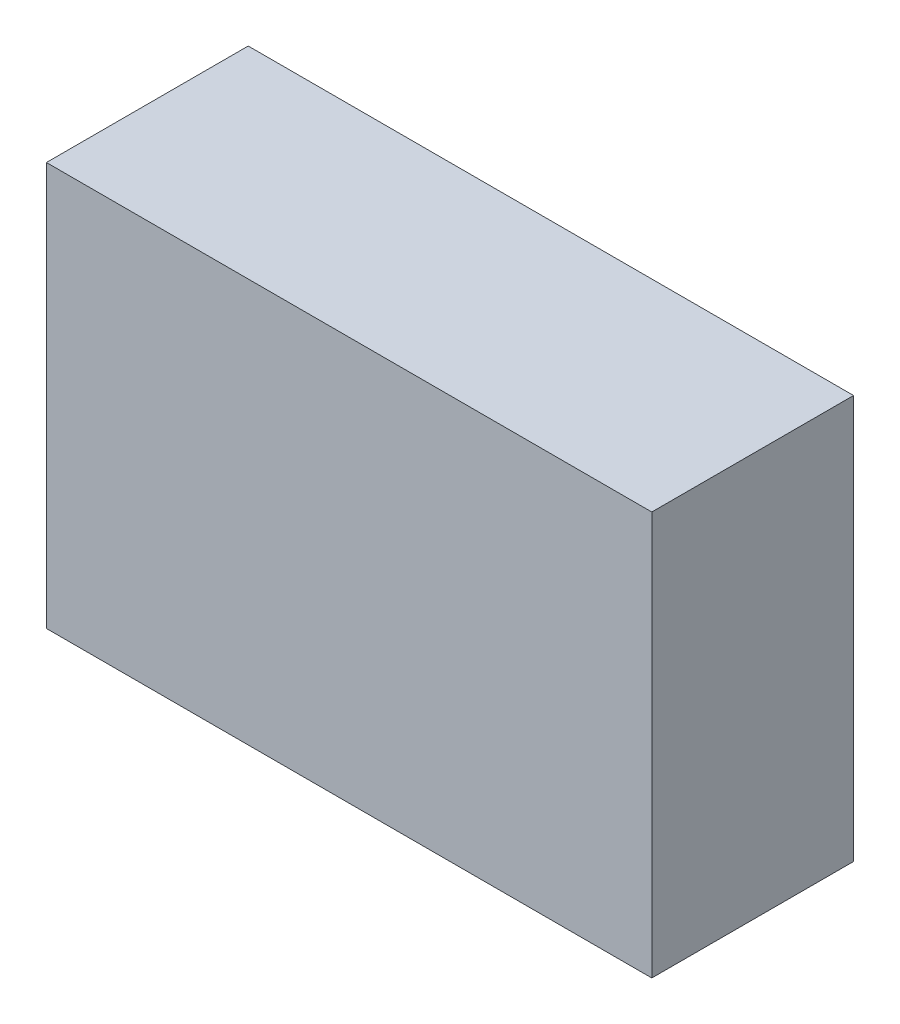
ISO-10303-21;
HEADER;
FILE_DESCRIPTION(('STEP AP214'),'2;1');
FILE_NAME('part.step','',(''),(''),'','','');
FILE_SCHEMA(('AUTOMOTIVE_DESIGN { 1 0 10303 214 1 1 1 1 }'));
ENDSEC;
DATA;
#1=APPLICATION_CONTEXT('core data for automotive mechanical design processes');
#2=APPLICATION_PROTOCOL_DEFINITION('international standard','automotive_design',2000,#1);
#3=PRODUCT_CONTEXT('',#1,'mechanical');
#4=PRODUCT('Part','Part','',(#3));
#5=PRODUCT_RELATED_PRODUCT_CATEGORY('part','',(#4));
#6=PRODUCT_DEFINITION_FORMATION('','',#4);
#7=PRODUCT_DEFINITION_CONTEXT('part definition',#1,'design');
#8=PRODUCT_DEFINITION('design','',#6,#7);
#9=PRODUCT_DEFINITION_SHAPE('','',#8);
#10=(LENGTH_UNIT() NAMED_UNIT(*) SI_UNIT(.MILLI.,.METRE.));
#11=(NAMED_UNIT(*) PLANE_ANGLE_UNIT() SI_UNIT($,.RADIAN.));
#12=(NAMED_UNIT(*) SI_UNIT($,.STERADIAN.) SOLID_ANGLE_UNIT());
#13=UNCERTAINTY_MEASURE_WITH_UNIT(LENGTH_MEASURE(1.E-05),#10,'distance_accuracy_value','');
#14=(GEOMETRIC_REPRESENTATION_CONTEXT(3) GLOBAL_UNCERTAINTY_ASSIGNED_CONTEXT((#13)) GLOBAL_UNIT_ASSIGNED_CONTEXT((#10,
#11,#12)) REPRESENTATION_CONTEXT('',''));
#15=CARTESIAN_POINT('',(0.,0.,0.));
#16=DIRECTION('',(0.,0.,1.));
#17=DIRECTION('',(1.,0.,0.));
#18=AXIS2_PLACEMENT_3D('',#15,#16,#17);
#19=CARTESIAN_POINT('',(9.55156950672646,37.5336322869955,20.));
#20=DIRECTION('',(-1.,0.,0.));
#21=DIRECTION('',(0.,-1.,0.));
#22=AXIS2_PLACEMENT_3D('',#19,#20,#21);
#23=PLANE('',#22);
#24=DIRECTION('',(0.,1.,0.));
#25=VECTOR('',#24,1.);
#26=CARTESIAN_POINT('',(9.55156950672646,37.5336322869955,0.));
#27=LINE('',#26,#25);
#28=CARTESIAN_POINT('',(9.55156950672647,-2.46636771300448,0.));
#29=VERTEX_POINT('',#28);
#30=CARTESIAN_POINT('',(9.55156950672646,37.5336322869955,0.));
#31=VERTEX_POINT('',#30);
#32=EDGE_CURVE('E141',#29,#31,#27,.T.);
#33=ORIENTED_EDGE('',*,*,#32,.T.);
#34=DIRECTION('',(0.,0.,-1.));
#35=VECTOR('',#34,1.);
#36=CARTESIAN_POINT('',(9.55156950672646,37.5336322869955,20.));
#37=LINE('',#36,#35);
#38=CARTESIAN_POINT('',(9.55156950672646,37.5336322869955,20.));
#39=VERTEX_POINT('',#38);
#40=EDGE_CURVE('E11',#39,#31,#37,.T.);
#41=ORIENTED_EDGE('',*,*,#40,.F.);
#42=DIRECTION('',(0.,1.,0.));
#43=VECTOR('',#42,1.);
#44=CARTESIAN_POINT('',(9.55156950672646,37.5336322869955,20.));
#45=LINE('',#44,#43);
#46=CARTESIAN_POINT('',(9.55156950672647,-2.46636771300448,20.));
#47=VERTEX_POINT('',#46);
#48=EDGE_CURVE('E145',#47,#39,#45,.T.);
#49=ORIENTED_EDGE('',*,*,#48,.F.);
#50=DIRECTION('',(0.,0.,-1.));
#51=VECTOR('',#50,1.);
#52=CARTESIAN_POINT('',(9.55156950672647,-2.46636771300448,20.));
#53=LINE('',#52,#51);
#54=EDGE_CURVE('E151',#47,#29,#53,.T.);
#55=ORIENTED_EDGE('',*,*,#54,.T.);
#56=EDGE_LOOP('',(#33,#41,#49,#55));
#57=FACE_BOUND('',#56,.T.);
#58=ADVANCED_FACE('F33',(#57),#23,.F.);
#59=CARTESIAN_POINT('',(-50.4484304932735,37.5336322869955,20.));
#60=DIRECTION('',(0.,-1.,0.));
#61=DIRECTION('',(0.,0.,-1.));
#62=AXIS2_PLACEMENT_3D('',#59,#60,#61);
#63=PLANE('',#62);
#64=DIRECTION('',(-1.,0.,0.));
#65=VECTOR('',#64,1.);
#66=CARTESIAN_POINT('',(-50.4484304932735,37.5336322869955,0.));
#67=LINE('',#66,#65);
#68=CARTESIAN_POINT('',(-50.4484304932735,37.5336322869955,0.));
#69=VERTEX_POINT('',#68);
#70=EDGE_CURVE('E154',#31,#69,#67,.T.);
#71=ORIENTED_EDGE('',*,*,#70,.T.);
#72=DIRECTION('',(0.,0.,-1.));
#73=VECTOR('',#72,1.);
#74=CARTESIAN_POINT('',(-50.4484304932735,37.5336322869955,20.));
#75=LINE('',#74,#73);
#76=CARTESIAN_POINT('',(-50.4484304932735,37.5336322869955,20.));
#77=VERTEX_POINT('',#76);
#78=EDGE_CURVE('E40',#77,#69,#75,.T.);
#79=ORIENTED_EDGE('',*,*,#78,.F.);
#80=DIRECTION('',(-1.,0.,0.));
#81=VECTOR('',#80,1.);
#82=CARTESIAN_POINT('',(-50.4484304932735,37.5336322869955,20.));
#83=LINE('',#82,#81);
#84=EDGE_CURVE('E84',#39,#77,#83,.T.);
#85=ORIENTED_EDGE('',*,*,#84,.F.);
#86=ORIENTED_EDGE('',*,*,#40,.T.);
#87=EDGE_LOOP('',(#71,#79,#85,#86));
#88=FACE_BOUND('',#87,.T.);
#89=ADVANCED_FACE('F182',(#88),#63,.F.);
#90=CARTESIAN_POINT('',(-50.4484304932735,37.5336322869955,20.));
#91=DIRECTION('',(1.,0.,0.));
#92=DIRECTION('',(0.,1.,0.));
#93=AXIS2_PLACEMENT_3D('',#90,#91,#92);
#94=PLANE('',#93);
#95=DIRECTION('',(0.,0.,-1.));
#96=VECTOR('',#95,1.);
#97=CARTESIAN_POINT('',(-50.4484304932735,19.7645338009479,0.0671765926394813));
#98=LINE('',#97,#96);
#99=CARTESIAN_POINT('',(-50.4484304932735,19.7645338009479,2.61677832287105));
#100=VERTEX_POINT('',#99);
#101=CARTESIAN_POINT('',(-50.4484304932735,19.7645338009479,0.0671765926394813));
#102=VERTEX_POINT('',#101);
#103=EDGE_CURVE('E135',#100,#102,#98,.T.);
#104=ORIENTED_EDGE('',*,*,#103,.F.);
#105=DIRECTION('',(0.,1.,0.));
#106=VECTOR('',#105,1.);
#107=CARTESIAN_POINT('',(-50.4484304932735,19.7645338009479,2.61677832287105));
#108=LINE('',#107,#106);
#109=CARTESIAN_POINT('',(-50.4484304932735,15.3027307730431,2.61677832287105));
#110=VERTEX_POINT('',#109);
#111=EDGE_CURVE('E47',#110,#100,#108,.T.);
#112=ORIENTED_EDGE('',*,*,#111,.F.);
#113=DIRECTION('',(0.,0.,1.));
#114=VECTOR('',#113,1.);
#115=CARTESIAN_POINT('',(-50.4484304932735,15.3027307730431,0.0671765926394813));
#116=LINE('',#115,#114);
#117=CARTESIAN_POINT('',(-50.4484304932735,15.3027307730431,0.0671765926394813));
#118=VERTEX_POINT('',#117);
#119=EDGE_CURVE('E126',#118,#110,#116,.T.);
#120=ORIENTED_EDGE('',*,*,#119,.F.);
#121=DIRECTION('',(0.,-1.,0.));
#122=VECTOR('',#121,1.);
#123=CARTESIAN_POINT('',(-50.4484304932735,19.7645338009479,0.0671765926394813));
#124=LINE('',#123,#122);
#125=EDGE_CURVE('E129',#102,#118,#124,.T.);
#126=ORIENTED_EDGE('',*,*,#125,.F.);
#127=EDGE_LOOP('',(#104,#112,#120,#126));
#128=FACE_BOUND('',#127,.T.);
#129=DIRECTION('',(0.,-1.,0.));
#130=VECTOR('',#129,1.);
#131=CARTESIAN_POINT('',(-50.4484304932735,37.5336322869955,0.));
#132=LINE('',#131,#130);
#133=CARTESIAN_POINT('',(-50.4484304932735,-2.46636771300448,0.));
#134=VERTEX_POINT('',#133);
#135=EDGE_CURVE('E156',#69,#134,#132,.T.);
#136=ORIENTED_EDGE('',*,*,#135,.T.);
#137=DIRECTION('',(0.,0.,-1.));
#138=VECTOR('',#137,1.);
#139=CARTESIAN_POINT('',(-50.4484304932735,-2.46636771300448,20.));
#140=LINE('',#139,#138);
#141=CARTESIAN_POINT('',(-50.4484304932735,-2.46636771300448,20.));
#142=VERTEX_POINT('',#141);
#143=EDGE_CURVE('E160',#142,#134,#140,.T.);
#144=ORIENTED_EDGE('',*,*,#143,.F.);
#145=DIRECTION('',(0.,-1.,0.));
#146=VECTOR('',#145,1.);
#147=CARTESIAN_POINT('',(-50.4484304932735,37.5336322869955,20.));
#148=LINE('',#147,#146);
#149=EDGE_CURVE('E148',#77,#142,#148,.T.);
#150=ORIENTED_EDGE('',*,*,#149,.F.);
#151=ORIENTED_EDGE('',*,*,#78,.T.);
#152=EDGE_LOOP('',(#136,#144,#150,#151));
#153=FACE_BOUND('',#152,.T.);
#154=ADVANCED_FACE('F165',(#128,#153),#94,.F.);
#155=CARTESIAN_POINT('',(-50.4484304932735,-2.46636771300448,20.));
#156=DIRECTION('',(0.,1.,0.));
#157=DIRECTION('',(0.,0.,1.));
#158=AXIS2_PLACEMENT_3D('',#155,#156,#157);
#159=PLANE('',#158);
#160=DIRECTION('',(1.,0.,0.));
#161=VECTOR('',#160,1.);
#162=CARTESIAN_POINT('',(-50.4484304932735,-2.46636771300448,0.));
#163=LINE('',#162,#161);
#164=EDGE_CURVE('E77',#134,#29,#163,.T.);
#165=ORIENTED_EDGE('',*,*,#164,.T.);
#166=ORIENTED_EDGE('',*,*,#54,.F.);
#167=DIRECTION('',(1.,0.,0.));
#168=VECTOR('',#167,1.);
#169=CARTESIAN_POINT('',(-50.4484304932735,-2.46636771300448,20.));
#170=LINE('',#169,#168);
#171=EDGE_CURVE('E56',#142,#47,#170,.T.);
#172=ORIENTED_EDGE('',*,*,#171,.F.);
#173=ORIENTED_EDGE('',*,*,#143,.T.);
#174=EDGE_LOOP('',(#165,#166,#172,#173));
#175=FACE_BOUND('',#174,.T.);
#176=ADVANCED_FACE('F173',(#175),#159,.F.);
#177=CARTESIAN_POINT('',(0.,0.,20.));
#178=DIRECTION('',(0.,0.,1.));
#179=DIRECTION('',(1.,0.,0.));
#180=AXIS2_PLACEMENT_3D('',#177,#178,#179);
#181=PLANE('',#180);
#182=ORIENTED_EDGE('',*,*,#48,.T.);
#183=ORIENTED_EDGE('',*,*,#84,.T.);
#184=ORIENTED_EDGE('',*,*,#149,.T.);
#185=ORIENTED_EDGE('',*,*,#171,.T.);
#186=EDGE_LOOP('',(#182,#183,#184,#185));
#187=FACE_BOUND('',#186,.T.);
#188=ADVANCED_FACE('F175',(#187),#181,.T.);
#189=CARTESIAN_POINT('',(0.,0.,0.));
#190=DIRECTION('',(0.,0.,1.));
#191=DIRECTION('',(1.,0.,0.));
#192=AXIS2_PLACEMENT_3D('',#189,#190,#191);
#193=PLANE('',#192);
#194=ORIENTED_EDGE('',*,*,#32,.F.);
#195=ORIENTED_EDGE('',*,*,#164,.F.);
#196=ORIENTED_EDGE('',*,*,#135,.F.);
#197=ORIENTED_EDGE('',*,*,#70,.F.);
#198=EDGE_LOOP('',(#194,#195,#196,#197));
#199=FACE_BOUND('',#198,.T.);
#200=ADVANCED_FACE('F169',(#199),#193,.F.);
#201=CARTESIAN_POINT('',(-30.4484304932735,19.7645338009479,2.61677832287105));
#202=DIRECTION('',(0.,0.,1.));
#203=DIRECTION('',(1.,0.,0.));
#204=AXIS2_PLACEMENT_3D('',#201,#202,#203);
#205=PLANE('',#204);
#206=ORIENTED_EDGE('',*,*,#111,.T.);
#207=DIRECTION('',(-1.,0.,0.));
#208=VECTOR('',#207,1.);
#209=CARTESIAN_POINT('',(-30.4484304932735,19.7645338009479,2.61677832287105));
#210=LINE('',#209,#208);
#211=CARTESIAN_POINT('',(-30.4484304932735,19.7645338009479,2.61677832287105));
#212=VERTEX_POINT('',#211);
#213=EDGE_CURVE('E104',#212,#100,#210,.T.);
#214=ORIENTED_EDGE('',*,*,#213,.F.);
#215=DIRECTION('',(0.,1.,0.));
#216=VECTOR('',#215,1.);
#217=CARTESIAN_POINT('',(-30.4484304932735,19.7645338009479,2.61677832287105));
#218=LINE('',#217,#216);
#219=CARTESIAN_POINT('',(-30.4484304932735,15.3027307730431,2.61677832287105));
#220=VERTEX_POINT('',#219);
#221=EDGE_CURVE('E108',#220,#212,#218,.T.);
#222=ORIENTED_EDGE('',*,*,#221,.F.);
#223=DIRECTION('',(-1.,0.,0.));
#224=VECTOR('',#223,1.);
#225=CARTESIAN_POINT('',(-30.4484304932735,15.3027307730431,2.61677832287105));
#226=LINE('',#225,#224);
#227=EDGE_CURVE('E139',#220,#110,#226,.T.);
#228=ORIENTED_EDGE('',*,*,#227,.T.);
#229=EDGE_LOOP('',(#206,#214,#222,#228));
#230=FACE_BOUND('',#229,.T.);
#231=ADVANCED_FACE('F106',(#230),#205,.F.);
#232=CARTESIAN_POINT('',(-30.4484304932735,15.3027307730431,0.0671765926394813));
#233=DIRECTION('',(0.,-1.,0.));
#234=DIRECTION('',(1.,0.,0.));
#235=AXIS2_PLACEMENT_3D('',#232,#233,#234);
#236=PLANE('',#235);
#237=ORIENTED_EDGE('',*,*,#119,.T.);
#238=ORIENTED_EDGE('',*,*,#227,.F.);
#239=DIRECTION('',(0.,0.,1.));
#240=VECTOR('',#239,1.);
#241=CARTESIAN_POINT('',(-30.4484304932735,15.3027307730431,0.0671765926394813));
#242=LINE('',#241,#240);
#243=CARTESIAN_POINT('',(-30.4484304932735,15.3027307730431,0.0671765926394813));
#244=VERTEX_POINT('',#243);
#245=EDGE_CURVE('E114',#244,#220,#242,.T.);
#246=ORIENTED_EDGE('',*,*,#245,.F.);
#247=DIRECTION('',(-1.,0.,0.));
#248=VECTOR('',#247,1.);
#249=CARTESIAN_POINT('',(-30.4484304932735,15.3027307730431,0.0671765926394813));
#250=LINE('',#249,#248);
#251=EDGE_CURVE('E142',#244,#118,#250,.T.);
#252=ORIENTED_EDGE('',*,*,#251,.T.);
#253=EDGE_LOOP('',(#237,#238,#246,#252));
#254=FACE_BOUND('',#253,.T.);
#255=ADVANCED_FACE('F211',(#254),#236,.F.);
#256=CARTESIAN_POINT('',(-30.4484304932735,19.7645338009479,0.0671765926394813));
#257=DIRECTION('',(0.,0.,-1.));
#258=DIRECTION('',(-1.,0.,0.));
#259=AXIS2_PLACEMENT_3D('',#256,#257,#258);
#260=PLANE('',#259);
#261=ORIENTED_EDGE('',*,*,#125,.T.);
#262=ORIENTED_EDGE('',*,*,#251,.F.);
#263=DIRECTION('',(0.,-1.,0.));
#264=VECTOR('',#263,1.);
#265=CARTESIAN_POINT('',(-30.4484304932735,19.7645338009479,0.0671765926394813));
#266=LINE('',#265,#264);
#267=CARTESIAN_POINT('',(-30.4484304932735,19.7645338009479,0.0671765926394813));
#268=VERTEX_POINT('',#267);
#269=EDGE_CURVE('E122',#268,#244,#266,.T.);
#270=ORIENTED_EDGE('',*,*,#269,.F.);
#271=DIRECTION('',(-1.,0.,0.));
#272=VECTOR('',#271,1.);
#273=CARTESIAN_POINT('',(-30.4484304932735,19.7645338009479,0.0671765926394813));
#274=LINE('',#273,#272);
#275=EDGE_CURVE('E113',#268,#102,#274,.T.);
#276=ORIENTED_EDGE('',*,*,#275,.T.);
#277=EDGE_LOOP('',(#261,#262,#270,#276));
#278=FACE_BOUND('',#277,.T.);
#279=ADVANCED_FACE('F220',(#278),#260,.F.);
#280=CARTESIAN_POINT('',(-30.4484304932735,19.7645338009479,0.0671765926394813));
#281=DIRECTION('',(0.,1.,0.));
#282=DIRECTION('',(-1.,0.,0.));
#283=AXIS2_PLACEMENT_3D('',#280,#281,#282);
#284=PLANE('',#283);
#285=ORIENTED_EDGE('',*,*,#103,.T.);
#286=ORIENTED_EDGE('',*,*,#275,.F.);
#287=DIRECTION('',(0.,0.,-1.));
#288=VECTOR('',#287,1.);
#289=CARTESIAN_POINT('',(-30.4484304932735,19.7645338009479,0.0671765926394813));
#290=LINE('',#289,#288);
#291=EDGE_CURVE('E117',#212,#268,#290,.T.);
#292=ORIENTED_EDGE('',*,*,#291,.F.);
#293=ORIENTED_EDGE('',*,*,#213,.T.);
#294=EDGE_LOOP('',(#285,#286,#292,#293));
#295=FACE_BOUND('',#294,.T.);
#296=ADVANCED_FACE('F118',(#295),#284,.F.);
#297=CARTESIAN_POINT('',(-30.4484304932735,0.,0.));
#298=DIRECTION('',(-1.,0.,0.));
#299=DIRECTION('',(0.,0.,1.));
#300=AXIS2_PLACEMENT_3D('',#297,#298,#299);
#301=PLANE('',#300);
#302=ORIENTED_EDGE('',*,*,#221,.T.);
#303=ORIENTED_EDGE('',*,*,#291,.T.);
#304=ORIENTED_EDGE('',*,*,#269,.T.);
#305=ORIENTED_EDGE('',*,*,#245,.T.);
#306=EDGE_LOOP('',(#302,#303,#304,#305));
#307=FACE_BOUND('',#306,.T.);
#308=ADVANCED_FACE('F124',(#307),#301,.T.);
#309=CLOSED_SHELL('',(#58,#89,#154,#176,#188,#200,#231,#255,#279,#296,#308));
#310=MANIFOLD_SOLID_BREP('B2',#309);
#311=ADVANCED_BREP_SHAPE_REPRESENTATION('',(#18,#310),#14);
#312=SHAPE_DEFINITION_REPRESENTATION(#9,#311);
ENDSEC;
END-ISO-10303-21;
